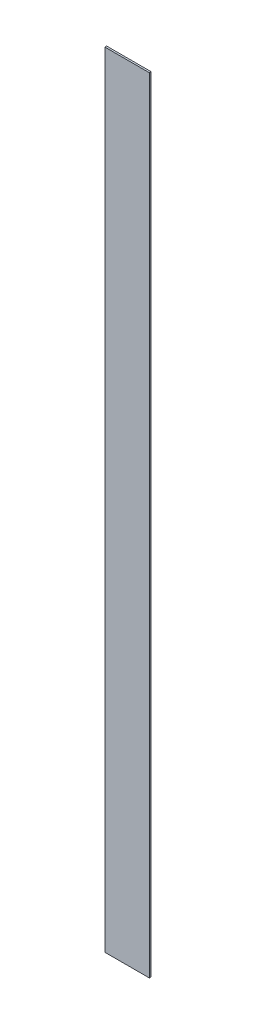
ISO-10303-21;
HEADER;
FILE_DESCRIPTION(('STEP AP214'),'2;1');
FILE_NAME('part.step','',(''),(''),'','','');
FILE_SCHEMA(('AUTOMOTIVE_DESIGN { 1 0 10303 214 1 1 1 1 }'));
ENDSEC;
DATA;
#1=APPLICATION_CONTEXT('core data for automotive mechanical design processes');
#2=APPLICATION_PROTOCOL_DEFINITION('international standard','automotive_design',2000,#1);
#3=PRODUCT_CONTEXT('',#1,'mechanical');
#4=PRODUCT('Part','Part','',(#3));
#5=PRODUCT_RELATED_PRODUCT_CATEGORY('part','',(#4));
#6=PRODUCT_DEFINITION_FORMATION('','',#4);
#7=PRODUCT_DEFINITION_CONTEXT('part definition',#1,'design');
#8=PRODUCT_DEFINITION('design','',#6,#7);
#9=PRODUCT_DEFINITION_SHAPE('','',#8);
#10=(LENGTH_UNIT() NAMED_UNIT(*) SI_UNIT(.MILLI.,.METRE.));
#11=(NAMED_UNIT(*) PLANE_ANGLE_UNIT() SI_UNIT($,.RADIAN.));
#12=(NAMED_UNIT(*) SI_UNIT($,.STERADIAN.) SOLID_ANGLE_UNIT());
#13=UNCERTAINTY_MEASURE_WITH_UNIT(LENGTH_MEASURE(1.E-05),#10,'distance_accuracy_value','');
#14=(GEOMETRIC_REPRESENTATION_CONTEXT(3) GLOBAL_UNCERTAINTY_ASSIGNED_CONTEXT((#13)) GLOBAL_UNIT_ASSIGNED_CONTEXT((#10,
#11,#12)) REPRESENTATION_CONTEXT('',''));
#15=CARTESIAN_POINT('',(0.,0.,0.));
#16=DIRECTION('',(0.,0.,1.));
#17=DIRECTION('',(1.,0.,0.));
#18=AXIS2_PLACEMENT_3D('',#15,#16,#17);
#19=CARTESIAN_POINT('',(25.,440.,1.));
#20=DIRECTION('',(-1.,0.,0.));
#21=DIRECTION('',(0.,-1.,0.));
#22=AXIS2_PLACEMENT_3D('',#19,#20,#21);
#23=PLANE('',#22);
#24=DIRECTION('',(0.,1.,0.));
#25=VECTOR('',#24,1.);
#26=CARTESIAN_POINT('',(25.,440.,-1.));
#27=LINE('',#26,#25);
#28=CARTESIAN_POINT('',(25.0000000000001,-440.,-1.));
#29=VERTEX_POINT('',#28);
#30=CARTESIAN_POINT('',(25.,440.,-1.));
#31=VERTEX_POINT('',#30);
#32=EDGE_CURVE('E107',#29,#31,#27,.T.);
#33=ORIENTED_EDGE('',*,*,#32,.T.);
#34=DIRECTION('',(0.,0.,-1.));
#35=VECTOR('',#34,1.);
#36=CARTESIAN_POINT('',(25.,440.,1.));
#37=LINE('',#36,#35);
#38=CARTESIAN_POINT('',(25.,440.,1.));
#39=VERTEX_POINT('',#38);
#40=EDGE_CURVE('E11',#39,#31,#37,.T.);
#41=ORIENTED_EDGE('',*,*,#40,.F.);
#42=DIRECTION('',(0.,1.,0.));
#43=VECTOR('',#42,1.);
#44=CARTESIAN_POINT('',(25.,440.,1.));
#45=LINE('',#44,#43);
#46=CARTESIAN_POINT('',(25.0000000000001,-440.,1.));
#47=VERTEX_POINT('',#46);
#48=EDGE_CURVE('E91',#47,#39,#45,.T.);
#49=ORIENTED_EDGE('',*,*,#48,.F.);
#50=DIRECTION('',(0.,0.,-1.));
#51=VECTOR('',#50,1.);
#52=CARTESIAN_POINT('',(25.0000000000001,-440.,1.));
#53=LINE('',#52,#51);
#54=EDGE_CURVE('E103',#47,#29,#53,.T.);
#55=ORIENTED_EDGE('',*,*,#54,.T.);
#56=EDGE_LOOP('',(#33,#41,#49,#55));
#57=FACE_BOUND('',#56,.T.);
#58=ADVANCED_FACE('F39',(#57),#23,.F.);
#59=CARTESIAN_POINT('',(-25.,440.,1.));
#60=DIRECTION('',(0.,-1.,0.));
#61=DIRECTION('',(0.,0.,-1.));
#62=AXIS2_PLACEMENT_3D('',#59,#60,#61);
#63=PLANE('',#62);
#64=DIRECTION('',(-1.,0.,0.));
#65=VECTOR('',#64,1.);
#66=CARTESIAN_POINT('',(-25.,440.,-1.));
#67=LINE('',#66,#65);
#68=CARTESIAN_POINT('',(-25.,440.,-1.));
#69=VERTEX_POINT('',#68);
#70=EDGE_CURVE('E96',#31,#69,#67,.T.);
#71=ORIENTED_EDGE('',*,*,#70,.T.);
#72=DIRECTION('',(0.,0.,-1.));
#73=VECTOR('',#72,1.);
#74=CARTESIAN_POINT('',(-25.,440.,1.));
#75=LINE('',#74,#73);
#76=CARTESIAN_POINT('',(-25.,440.,1.));
#77=VERTEX_POINT('',#76);
#78=EDGE_CURVE('E48',#77,#69,#75,.T.);
#79=ORIENTED_EDGE('',*,*,#78,.F.);
#80=DIRECTION('',(-1.,0.,0.));
#81=VECTOR('',#80,1.);
#82=CARTESIAN_POINT('',(-25.,440.,1.));
#83=LINE('',#82,#81);
#84=EDGE_CURVE('E86',#39,#77,#83,.T.);
#85=ORIENTED_EDGE('',*,*,#84,.F.);
#86=ORIENTED_EDGE('',*,*,#40,.T.);
#87=EDGE_LOOP('',(#71,#79,#85,#86));
#88=FACE_BOUND('',#87,.T.);
#89=ADVANCED_FACE('F95',(#88),#63,.F.);
#90=CARTESIAN_POINT('',(-25.,440.,1.));
#91=DIRECTION('',(1.,0.,0.));
#92=DIRECTION('',(0.,1.,0.));
#93=AXIS2_PLACEMENT_3D('',#90,#91,#92);
#94=PLANE('',#93);
#95=DIRECTION('',(0.,-1.,0.));
#96=VECTOR('',#95,1.);
#97=CARTESIAN_POINT('',(-25.,440.,-1.));
#98=LINE('',#97,#96);
#99=CARTESIAN_POINT('',(-24.9999999999999,-440.,-1.));
#100=VERTEX_POINT('',#99);
#101=EDGE_CURVE('E73',#69,#100,#98,.T.);
#102=ORIENTED_EDGE('',*,*,#101,.T.);
#103=DIRECTION('',(0.,0.,-1.));
#104=VECTOR('',#103,1.);
#105=CARTESIAN_POINT('',(-24.9999999999999,-440.,1.));
#106=LINE('',#105,#104);
#107=CARTESIAN_POINT('',(-24.9999999999999,-440.,1.));
#108=VERTEX_POINT('',#107);
#109=EDGE_CURVE('E98',#108,#100,#106,.T.);
#110=ORIENTED_EDGE('',*,*,#109,.F.);
#111=DIRECTION('',(0.,-1.,0.));
#112=VECTOR('',#111,1.);
#113=CARTESIAN_POINT('',(-25.,440.,1.));
#114=LINE('',#113,#112);
#115=EDGE_CURVE('E89',#77,#108,#114,.T.);
#116=ORIENTED_EDGE('',*,*,#115,.F.);
#117=ORIENTED_EDGE('',*,*,#78,.T.);
#118=EDGE_LOOP('',(#102,#110,#116,#117));
#119=FACE_BOUND('',#118,.T.);
#120=ADVANCED_FACE('F99',(#119),#94,.F.);
#121=CARTESIAN_POINT('',(-24.9999999999999,-440.,1.));
#122=DIRECTION('',(0.,1.,0.));
#123=DIRECTION('',(0.,0.,1.));
#124=AXIS2_PLACEMENT_3D('',#121,#122,#123);
#125=PLANE('',#124);
#126=DIRECTION('',(1.,0.,0.));
#127=VECTOR('',#126,1.);
#128=CARTESIAN_POINT('',(-24.9999999999999,-440.,-1.));
#129=LINE('',#128,#127);
#130=EDGE_CURVE('E79',#100,#29,#129,.T.);
#131=ORIENTED_EDGE('',*,*,#130,.T.);
#132=ORIENTED_EDGE('',*,*,#54,.F.);
#133=DIRECTION('',(1.,0.,0.));
#134=VECTOR('',#133,1.);
#135=CARTESIAN_POINT('',(-24.9999999999999,-440.,1.));
#136=LINE('',#135,#134);
#137=EDGE_CURVE('E56',#108,#47,#136,.T.);
#138=ORIENTED_EDGE('',*,*,#137,.F.);
#139=ORIENTED_EDGE('',*,*,#109,.T.);
#140=EDGE_LOOP('',(#131,#132,#138,#139));
#141=FACE_BOUND('',#140,.T.);
#142=ADVANCED_FACE('F120',(#141),#125,.F.);
#143=CARTESIAN_POINT('',(0.,0.,1.));
#144=DIRECTION('',(0.,0.,1.));
#145=DIRECTION('',(1.,0.,0.));
#146=AXIS2_PLACEMENT_3D('',#143,#144,#145);
#147=PLANE('',#146);
#148=ORIENTED_EDGE('',*,*,#48,.T.);
#149=ORIENTED_EDGE('',*,*,#84,.T.);
#150=ORIENTED_EDGE('',*,*,#115,.T.);
#151=ORIENTED_EDGE('',*,*,#137,.T.);
#152=EDGE_LOOP('',(#148,#149,#150,#151));
#153=FACE_BOUND('',#152,.T.);
#154=ADVANCED_FACE('F87',(#153),#147,.T.);
#155=CARTESIAN_POINT('',(0.,0.,-1.));
#156=DIRECTION('',(0.,0.,1.));
#157=DIRECTION('',(1.,0.,0.));
#158=AXIS2_PLACEMENT_3D('',#155,#156,#157);
#159=PLANE('',#158);
#160=ORIENTED_EDGE('',*,*,#32,.F.);
#161=ORIENTED_EDGE('',*,*,#130,.F.);
#162=ORIENTED_EDGE('',*,*,#101,.F.);
#163=ORIENTED_EDGE('',*,*,#70,.F.);
#164=EDGE_LOOP('',(#160,#161,#162,#163));
#165=FACE_BOUND('',#164,.T.);
#166=ADVANCED_FACE('F123',(#165),#159,.F.);
#167=CLOSED_SHELL('',(#58,#89,#120,#142,#154,#166));
#168=MANIFOLD_SOLID_BREP('B2',#167);
#169=ADVANCED_BREP_SHAPE_REPRESENTATION('',(#18,#168),#14);
#170=SHAPE_DEFINITION_REPRESENTATION(#9,#169);
ENDSEC;
END-ISO-10303-21;
